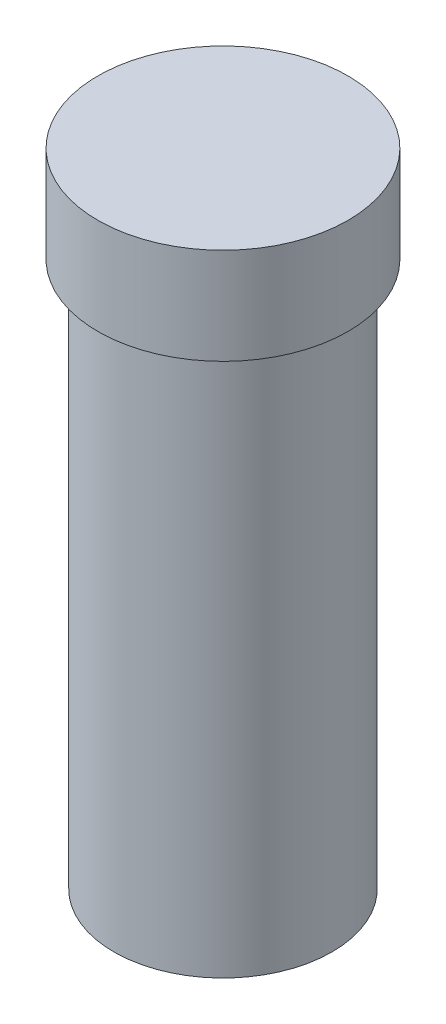
ISO-10303-21;
HEADER;
FILE_DESCRIPTION(('STEP AP214'),'2;1');
FILE_NAME('part.step','',(''),(''),'','','');
FILE_SCHEMA(('AUTOMOTIVE_DESIGN { 1 0 10303 214 1 1 1 1 }'));
ENDSEC;
DATA;
#1=APPLICATION_CONTEXT('core data for automotive mechanical design processes');
#2=APPLICATION_PROTOCOL_DEFINITION('international standard','automotive_design',2000,#1);
#3=PRODUCT_CONTEXT('',#1,'mechanical');
#4=PRODUCT('Part','Part','',(#3));
#5=PRODUCT_RELATED_PRODUCT_CATEGORY('part','',(#4));
#6=PRODUCT_DEFINITION_FORMATION('','',#4);
#7=PRODUCT_DEFINITION_CONTEXT('part definition',#1,'design');
#8=PRODUCT_DEFINITION('design','',#6,#7);
#9=PRODUCT_DEFINITION_SHAPE('','',#8);
#10=(LENGTH_UNIT() NAMED_UNIT(*) SI_UNIT(.MILLI.,.METRE.));
#11=(NAMED_UNIT(*) PLANE_ANGLE_UNIT() SI_UNIT($,.RADIAN.));
#12=(NAMED_UNIT(*) SI_UNIT($,.STERADIAN.) SOLID_ANGLE_UNIT());
#13=UNCERTAINTY_MEASURE_WITH_UNIT(LENGTH_MEASURE(1.E-05),#10,'distance_accuracy_value','');
#14=(GEOMETRIC_REPRESENTATION_CONTEXT(3) GLOBAL_UNCERTAINTY_ASSIGNED_CONTEXT((#13)) GLOBAL_UNIT_ASSIGNED_CONTEXT((#10,
#11,#12)) REPRESENTATION_CONTEXT('',''));
#15=CARTESIAN_POINT('',(0.,0.,0.));
#16=DIRECTION('',(0.,0.,1.));
#17=DIRECTION('',(1.,0.,0.));
#18=AXIS2_PLACEMENT_3D('',#15,#16,#17);
#19=CARTESIAN_POINT('',(0.,0.,0.));
#20=DIRECTION('',(0.,-1.,0.));
#21=DIRECTION('',(1.,0.,0.));
#22=AXIS2_PLACEMENT_3D('',#19,#20,#21);
#23=PLANE('',#22);
#24=DIRECTION('',(0.,0.,1.));
#25=VECTOR('',#24,1.);
#26=CARTESIAN_POINT('',(12.5,0.,-8.));
#27=LINE('',#26,#25);
#28=CARTESIAN_POINT('',(12.5,0.,-8.));
#29=VERTEX_POINT('',#28);
#30=CARTESIAN_POINT('',(12.5,0.,8.));
#31=VERTEX_POINT('',#30);
#32=EDGE_CURVE('E49',#29,#31,#27,.T.);
#33=ORIENTED_EDGE('',*,*,#32,.F.);
#34=DIRECTION('',(1.,0.,0.));
#35=VECTOR('',#34,1.);
#36=CARTESIAN_POINT('',(-12.5,0.,-8.));
#37=LINE('',#36,#35);
#38=CARTESIAN_POINT('',(-12.5,0.,-8.));
#39=VERTEX_POINT('',#38);
#40=EDGE_CURVE('E100',#39,#29,#37,.T.);
#41=ORIENTED_EDGE('',*,*,#40,.F.);
#42=DIRECTION('',(0.,0.,-1.));
#43=VECTOR('',#42,1.);
#44=CARTESIAN_POINT('',(-12.5,0.,-8.));
#45=LINE('',#44,#43);
#46=CARTESIAN_POINT('',(-12.5,0.,8.));
#47=VERTEX_POINT('',#46);
#48=EDGE_CURVE('E106',#47,#39,#45,.T.);
#49=ORIENTED_EDGE('',*,*,#48,.F.);
#50=DIRECTION('',(-1.,0.,0.));
#51=VECTOR('',#50,1.);
#52=CARTESIAN_POINT('',(-12.5,0.,8.));
#53=LINE('',#52,#51);
#54=EDGE_CURVE('E84',#31,#47,#53,.T.);
#55=ORIENTED_EDGE('',*,*,#54,.F.);
#56=EDGE_LOOP('',(#33,#41,#49,#55));
#57=FACE_BOUND('',#56,.T.);
#58=CARTESIAN_POINT('',(0.,0.,0.));
#59=DIRECTION('',(0.,-1.,0.));
#60=DIRECTION('',(1.,0.,0.));
#61=AXIS2_PLACEMENT_3D('',#58,#59,#60);
#62=CIRCLE('',#61,17.);
#63=CARTESIAN_POINT('',(17.,0.,0.));
#64=VERTEX_POINT('',#63);
#65=EDGE_CURVE('E11',#64,#64,#62,.T.);
#66=ORIENTED_EDGE('',*,*,#65,.T.);
#67=EDGE_LOOP('',(#66));
#68=FACE_BOUND('',#67,.T.);
#69=ADVANCED_FACE('F35',(#57,#68),#23,.T.);
#70=CARTESIAN_POINT('',(0.,0.,0.));
#71=DIRECTION('',(0.,-1.,0.));
#72=DIRECTION('',(1.,0.,0.));
#73=AXIS2_PLACEMENT_3D('',#70,#71,#72);
#74=CYLINDRICAL_SURFACE('',#73,17.);
#75=CARTESIAN_POINT('',(0.,85.,0.));
#76=DIRECTION('',(0.,-1.,0.));
#77=DIRECTION('',(1.,0.,0.));
#78=AXIS2_PLACEMENT_3D('',#75,#76,#77);
#79=CIRCLE('',#78,17.);
#80=CARTESIAN_POINT('',(17.,85.,0.));
#81=VERTEX_POINT('',#80);
#82=EDGE_CURVE('E42',#81,#81,#79,.T.);
#83=ORIENTED_EDGE('',*,*,#82,.T.);
#84=EDGE_LOOP('',(#83));
#85=FACE_BOUND('',#84,.T.);
#86=ORIENTED_EDGE('',*,*,#65,.F.);
#87=EDGE_LOOP('',(#86));
#88=FACE_BOUND('',#87,.T.);
#89=ADVANCED_FACE('F120',(#85,#88),#74,.T.);
#90=CARTESIAN_POINT('',(17.,85.,0.));
#91=DIRECTION('',(0.,-1.,0.));
#92=DIRECTION('',(1.,0.,0.));
#93=AXIS2_PLACEMENT_3D('',#90,#91,#92);
#94=PLANE('',#93);
#95=CARTESIAN_POINT('',(0.,85.,0.));
#96=DIRECTION('',(0.,-1.,0.));
#97=DIRECTION('',(1.,0.,0.));
#98=AXIS2_PLACEMENT_3D('',#95,#96,#97);
#99=CIRCLE('',#98,19.5);
#100=CARTESIAN_POINT('',(19.5,85.,0.));
#101=VERTEX_POINT('',#100);
#102=EDGE_CURVE('E115',#101,#101,#99,.T.);
#103=ORIENTED_EDGE('',*,*,#102,.T.);
#104=EDGE_LOOP('',(#103));
#105=FACE_BOUND('',#104,.T.);
#106=ORIENTED_EDGE('',*,*,#82,.F.);
#107=EDGE_LOOP('',(#106));
#108=FACE_BOUND('',#107,.T.);
#109=ADVANCED_FACE('F123',(#105,#108),#94,.T.);
#110=CARTESIAN_POINT('',(0.,0.,0.));
#111=DIRECTION('',(0.,-1.,0.));
#112=DIRECTION('',(1.,0.,0.));
#113=AXIS2_PLACEMENT_3D('',#110,#111,#112);
#114=CYLINDRICAL_SURFACE('',#113,19.5);
#115=CARTESIAN_POINT('',(0.,100.,0.));
#116=DIRECTION('',(0.,-1.,0.));
#117=DIRECTION('',(1.,0.,0.));
#118=AXIS2_PLACEMENT_3D('',#115,#116,#117);
#119=CIRCLE('',#118,19.5);
#120=CARTESIAN_POINT('',(19.5,100.,0.));
#121=VERTEX_POINT('',#120);
#122=EDGE_CURVE('E110',#121,#121,#119,.T.);
#123=ORIENTED_EDGE('',*,*,#122,.T.);
#124=EDGE_LOOP('',(#123));
#125=FACE_BOUND('',#124,.T.);
#126=ORIENTED_EDGE('',*,*,#102,.F.);
#127=EDGE_LOOP('',(#126));
#128=FACE_BOUND('',#127,.T.);
#129=ADVANCED_FACE('F125',(#125,#128),#114,.T.);
#130=CARTESIAN_POINT('',(19.5,100.,0.));
#131=DIRECTION('',(0.,1.,0.));
#132=DIRECTION('',(-1.,0.,0.));
#133=AXIS2_PLACEMENT_3D('',#130,#131,#132);
#134=PLANE('',#133);
#135=ORIENTED_EDGE('',*,*,#122,.F.);
#136=EDGE_LOOP('',(#135));
#137=FACE_BOUND('',#136,.T.);
#138=ADVANCED_FACE('F132',(#137),#134,.T.);
#139=CARTESIAN_POINT('',(12.5,65.,-8.));
#140=DIRECTION('',(1.,0.,0.));
#141=DIRECTION('',(0.,1.,0.));
#142=AXIS2_PLACEMENT_3D('',#139,#140,#141);
#143=PLANE('',#142);
#144=ORIENTED_EDGE('',*,*,#32,.T.);
#145=DIRECTION('',(0.,-1.,0.));
#146=VECTOR('',#145,1.);
#147=CARTESIAN_POINT('',(12.5,65.,8.));
#148=LINE('',#147,#146);
#149=CARTESIAN_POINT('',(12.5,65.,8.));
#150=VERTEX_POINT('',#149);
#151=EDGE_CURVE('E72',#150,#31,#148,.T.);
#152=ORIENTED_EDGE('',*,*,#151,.F.);
#153=DIRECTION('',(0.,0.,1.));
#154=VECTOR('',#153,1.);
#155=CARTESIAN_POINT('',(12.5,65.,-8.));
#156=LINE('',#155,#154);
#157=CARTESIAN_POINT('',(12.5,65.,-8.));
#158=VERTEX_POINT('',#157);
#159=EDGE_CURVE('E98',#158,#150,#156,.T.);
#160=ORIENTED_EDGE('',*,*,#159,.F.);
#161=DIRECTION('',(0.,-1.,0.));
#162=VECTOR('',#161,1.);
#163=CARTESIAN_POINT('',(12.5,65.,-8.));
#164=LINE('',#163,#162);
#165=EDGE_CURVE('E57',#158,#29,#164,.T.);
#166=ORIENTED_EDGE('',*,*,#165,.T.);
#167=EDGE_LOOP('',(#144,#152,#160,#166));
#168=FACE_BOUND('',#167,.T.);
#169=ADVANCED_FACE('F144',(#168),#143,.F.);
#170=CARTESIAN_POINT('',(-12.5,65.,-8.));
#171=DIRECTION('',(0.,0.,-1.));
#172=DIRECTION('',(-1.,0.,0.));
#173=AXIS2_PLACEMENT_3D('',#170,#171,#172);
#174=PLANE('',#173);
#175=ORIENTED_EDGE('',*,*,#40,.T.);
#176=ORIENTED_EDGE('',*,*,#165,.F.);
#177=DIRECTION('',(1.,0.,0.));
#178=VECTOR('',#177,1.);
#179=CARTESIAN_POINT('',(-12.5,65.,-8.));
#180=LINE('',#179,#178);
#181=CARTESIAN_POINT('',(-12.5,65.,-8.));
#182=VERTEX_POINT('',#181);
#183=EDGE_CURVE('E95',#182,#158,#180,.T.);
#184=ORIENTED_EDGE('',*,*,#183,.F.);
#185=DIRECTION('',(0.,-1.,0.));
#186=VECTOR('',#185,1.);
#187=CARTESIAN_POINT('',(-12.5,65.,-8.));
#188=LINE('',#187,#186);
#189=EDGE_CURVE('E88',#182,#39,#188,.T.);
#190=ORIENTED_EDGE('',*,*,#189,.T.);
#191=EDGE_LOOP('',(#175,#176,#184,#190));
#192=FACE_BOUND('',#191,.T.);
#193=ADVANCED_FACE('F142',(#192),#174,.F.);
#194=CARTESIAN_POINT('',(-12.5,65.,-8.));
#195=DIRECTION('',(-1.,0.,0.));
#196=DIRECTION('',(0.,-1.,0.));
#197=AXIS2_PLACEMENT_3D('',#194,#195,#196);
#198=PLANE('',#197);
#199=ORIENTED_EDGE('',*,*,#48,.T.);
#200=ORIENTED_EDGE('',*,*,#189,.F.);
#201=DIRECTION('',(0.,0.,-1.));
#202=VECTOR('',#201,1.);
#203=CARTESIAN_POINT('',(-12.5,65.,-8.));
#204=LINE('',#203,#202);
#205=CARTESIAN_POINT('',(-12.5,65.,8.));
#206=VERTEX_POINT('',#205);
#207=EDGE_CURVE('E91',#206,#182,#204,.T.);
#208=ORIENTED_EDGE('',*,*,#207,.F.);
#209=DIRECTION('',(0.,-1.,0.));
#210=VECTOR('',#209,1.);
#211=CARTESIAN_POINT('',(-12.5,65.,8.));
#212=LINE('',#211,#210);
#213=EDGE_CURVE('E77',#206,#47,#212,.T.);
#214=ORIENTED_EDGE('',*,*,#213,.T.);
#215=EDGE_LOOP('',(#199,#200,#208,#214));
#216=FACE_BOUND('',#215,.T.);
#217=ADVANCED_FACE('F92',(#216),#198,.F.);
#218=CARTESIAN_POINT('',(-12.5,65.,8.));
#219=DIRECTION('',(0.,0.,1.));
#220=DIRECTION('',(1.,0.,0.));
#221=AXIS2_PLACEMENT_3D('',#218,#219,#220);
#222=PLANE('',#221);
#223=ORIENTED_EDGE('',*,*,#54,.T.);
#224=ORIENTED_EDGE('',*,*,#213,.F.);
#225=DIRECTION('',(-1.,0.,0.));
#226=VECTOR('',#225,1.);
#227=CARTESIAN_POINT('',(-12.5,65.,8.));
#228=LINE('',#227,#226);
#229=EDGE_CURVE('E81',#150,#206,#228,.T.);
#230=ORIENTED_EDGE('',*,*,#229,.F.);
#231=ORIENTED_EDGE('',*,*,#151,.T.);
#232=EDGE_LOOP('',(#223,#224,#230,#231));
#233=FACE_BOUND('',#232,.T.);
#234=ADVANCED_FACE('F79',(#233),#222,.F.);
#235=CARTESIAN_POINT('',(0.,65.,0.));
#236=DIRECTION('',(0.,1.,0.));
#237=DIRECTION('',(-1.,0.,0.));
#238=AXIS2_PLACEMENT_3D('',#235,#236,#237);
#239=PLANE('',#238);
#240=ORIENTED_EDGE('',*,*,#159,.T.);
#241=ORIENTED_EDGE('',*,*,#229,.T.);
#242=ORIENTED_EDGE('',*,*,#207,.T.);
#243=ORIENTED_EDGE('',*,*,#183,.T.);
#244=EDGE_LOOP('',(#240,#241,#242,#243));
#245=FACE_BOUND('',#244,.T.);
#246=ADVANCED_FACE('F97',(#245),#239,.F.);
#247=CLOSED_SHELL('',(#69,#89,#109,#129,#138,#169,#193,#217,#234,#246));
#248=MANIFOLD_SOLID_BREP('B2',#247);
#249=ADVANCED_BREP_SHAPE_REPRESENTATION('',(#18,#248),#14);
#250=SHAPE_DEFINITION_REPRESENTATION(#9,#249);
ENDSEC;
END-ISO-10303-21;
